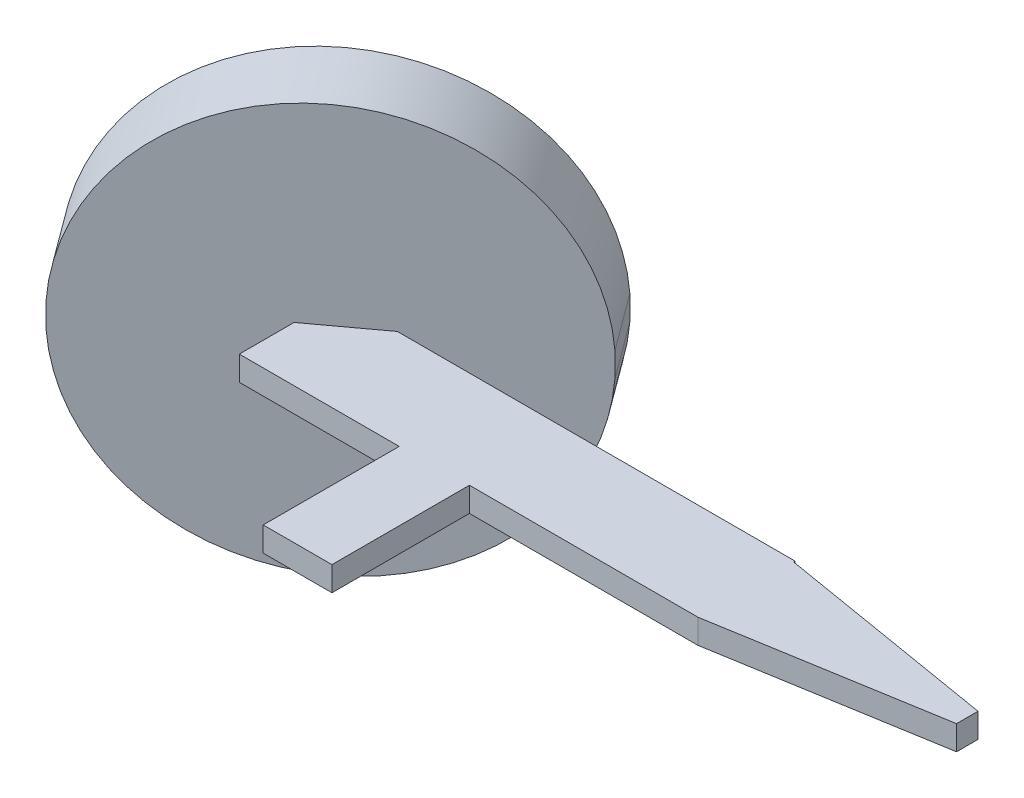
ISO-10303-21;
HEADER;
FILE_DESCRIPTION(('STEP AP214'),'2;1');
FILE_NAME('part.step','',(''),(''),'','','');
FILE_SCHEMA(('AUTOMOTIVE_DESIGN { 1 0 10303 214 1 1 1 1 }'));
ENDSEC;
DATA;
#1=APPLICATION_CONTEXT('core data for automotive mechanical design processes');
#2=APPLICATION_PROTOCOL_DEFINITION('international standard','automotive_design',2000,#1);
#3=PRODUCT_CONTEXT('',#1,'mechanical');
#4=PRODUCT('Part','Part','',(#3));
#5=PRODUCT_RELATED_PRODUCT_CATEGORY('part','',(#4));
#6=PRODUCT_DEFINITION_FORMATION('','',#4);
#7=PRODUCT_DEFINITION_CONTEXT('part definition',#1,'design');
#8=PRODUCT_DEFINITION('design','',#6,#7);
#9=PRODUCT_DEFINITION_SHAPE('','',#8);
#10=(LENGTH_UNIT() NAMED_UNIT(*) SI_UNIT(.MILLI.,.METRE.));
#11=(NAMED_UNIT(*) PLANE_ANGLE_UNIT() SI_UNIT($,.RADIAN.));
#12=(NAMED_UNIT(*) SI_UNIT($,.STERADIAN.) SOLID_ANGLE_UNIT());
#13=UNCERTAINTY_MEASURE_WITH_UNIT(LENGTH_MEASURE(1.E-05),#10,'distance_accuracy_value','');
#14=(GEOMETRIC_REPRESENTATION_CONTEXT(3) GLOBAL_UNCERTAINTY_ASSIGNED_CONTEXT((#13)) GLOBAL_UNIT_ASSIGNED_CONTEXT((#10,
#11,#12)) REPRESENTATION_CONTEXT('',''));
#15=CARTESIAN_POINT('',(0.,0.,0.));
#16=DIRECTION('',(0.,0.,1.));
#17=DIRECTION('',(1.,0.,0.));
#18=AXIS2_PLACEMENT_3D('',#15,#16,#17);
#19=CARTESIAN_POINT('',(0.,-4.,-7.34353741496602));
#20=DIRECTION('',(0.,0.,1.));
#21=DIRECTION('',(1.,0.,0.));
#22=AXIS2_PLACEMENT_3D('',#19,#20,#21);
#23=PLANE('',#22);
#24=DIRECTION('',(1.,0.,0.));
#25=VECTOR('',#24,1.);
#26=CARTESIAN_POINT('',(0.,-4.,-7.34353741496602));
#27=LINE('',#26,#25);
#28=CARTESIAN_POINT('',(5.63004535147378,-4.,-7.34353741496602));
#29=VERTEX_POINT('',#28);
#30=CARTESIAN_POINT('',(43.0820861678005,-4.,-7.34353741496602));
#31=VERTEX_POINT('',#30);
#32=EDGE_CURVE('E148',#29,#31,#27,.T.);
#33=ORIENTED_EDGE('',*,*,#32,.T.);
#34=DIRECTION('',(0.,-1.,0.));
#35=VECTOR('',#34,1.);
#36=CARTESIAN_POINT('',(43.0820861678005,11.,-7.34353741496602));
#37=LINE('',#36,#35);
#38=CARTESIAN_POINT('',(43.0820861678005,0.,-7.34353741496602));
#39=VERTEX_POINT('',#38);
#40=EDGE_CURVE('E241',#39,#31,#37,.T.);
#41=ORIENTED_EDGE('',*,*,#40,.F.);
#42=DIRECTION('',(1.,0.,0.));
#43=VECTOR('',#42,1.);
#44=CARTESIAN_POINT('',(0.,0.,-7.34353741496602));
#45=LINE('',#44,#43);
#46=CARTESIAN_POINT('',(5.63004535147378,0.,-7.34353741496602));
#47=VERTEX_POINT('',#46);
#48=EDGE_CURVE('E175',#47,#39,#45,.T.);
#49=ORIENTED_EDGE('',*,*,#48,.F.);
#50=DIRECTION('',(0.,1.,0.));
#51=VECTOR('',#50,1.);
#52=CARTESIAN_POINT('',(5.63004535147378,-4.,-7.34353741496602));
#53=LINE('',#52,#51);
#54=EDGE_CURVE('E52',#29,#47,#53,.T.);
#55=ORIENTED_EDGE('',*,*,#54,.F.);
#56=EDGE_LOOP('',(#33,#41,#49,#55));
#57=FACE_BOUND('',#56,.T.);
#58=ADVANCED_FACE('F35',(#57),#23,.T.);
#59=CARTESIAN_POINT('',(0.,-4.,0.));
#60=DIRECTION('',(0.,1.,0.));
#61=DIRECTION('',(0.,0.,1.));
#62=AXIS2_PLACEMENT_3D('',#59,#60,#61);
#63=PLANE('',#62);
#64=DIRECTION('',(-0.986254010758301,0.,0.165236274053746));
#65=VECTOR('',#64,1.);
#66=CARTESIAN_POINT('',(-0.0204677894799289,-4.,-0.122167118458326));
#67=LINE('',#66,#65);
#68=CARTESIAN_POINT('',(79.3459916191672,-4.,-13.4191655534149));
#69=VERTEX_POINT('',#68);
#70=EDGE_CURVE('E238',#69,#31,#67,.T.);
#71=ORIENTED_EDGE('',*,*,#70,.T.);
#72=ORIENTED_EDGE('',*,*,#32,.F.);
#73=DIRECTION('',(0.,0.,1.));
#74=VECTOR('',#73,1.);
#75=CARTESIAN_POINT('',(5.63004535147382,-4.,0.));
#76=LINE('',#75,#74);
#77=CARTESIAN_POINT('',(5.63004535147392,-4.,15.1766439909297));
#78=VERTEX_POINT('',#77);
#79=EDGE_CURVE('E138',#29,#78,#76,.T.);
#80=ORIENTED_EDGE('',*,*,#79,.T.);
#81=DIRECTION('',(1.,0.,0.));
#82=VECTOR('',#81,1.);
#83=CARTESIAN_POINT('',(0.,-4.,15.1766439909297));
#84=LINE('',#83,#82);
#85=CARTESIAN_POINT('',(-5.63004535147393,-4.,15.1766439909297));
#86=VERTEX_POINT('',#85);
#87=EDGE_CURVE('E122',#86,#78,#84,.T.);
#88=ORIENTED_EDGE('',*,*,#87,.F.);
#89=DIRECTION('',(0.,0.,1.));
#90=VECTOR('',#89,1.);
#91=CARTESIAN_POINT('',(-5.63004535147393,-4.,0.));
#92=LINE('',#91,#90);
#93=CARTESIAN_POINT('',(-5.63004535147393,-4.,-7.09875283446715));
#94=VERTEX_POINT('',#93);
#95=EDGE_CURVE('E135',#94,#86,#92,.T.);
#96=ORIENTED_EDGE('',*,*,#95,.F.);
#97=DIRECTION('',(1.,0.,0.));
#98=VECTOR('',#97,1.);
#99=CARTESIAN_POINT('',(0.,-4.,-7.09875283446715));
#100=LINE('',#99,#98);
#101=CARTESIAN_POINT('',(-31.8219954648526,-4.,-7.09875283446715));
#102=VERTEX_POINT('',#101);
#103=EDGE_CURVE('E141',#102,#94,#100,.T.);
#104=ORIENTED_EDGE('',*,*,#103,.F.);
#105=DIRECTION('',(0.,0.,-1.));
#106=VECTOR('',#105,1.);
#107=CARTESIAN_POINT('',(-31.8219954648526,-4.,0.));
#108=LINE('',#107,#106);
#109=CARTESIAN_POINT('',(-31.8219954648526,-4.,-16.0784819190834));
#110=VERTEX_POINT('',#109);
#111=EDGE_CURVE('E143',#102,#110,#108,.T.);
#112=ORIENTED_EDGE('',*,*,#111,.T.);
#113=DIRECTION('',(0.805055837353365,0.,-0.593199038049855));
#114=VECTOR('',#113,1.);
#115=CARTESIAN_POINT('',(-18.876099284717,-4.,-25.6175633149728));
#116=LINE('',#115,#114);
#117=CARTESIAN_POINT('',(-22.0830660835763,-4.,-23.2545351473923));
#118=VERTEX_POINT('',#117);
#119=EDGE_CURVE('E155',#110,#118,#116,.T.);
#120=ORIENTED_EDGE('',*,*,#119,.T.);
#121=DIRECTION('',(1.,0.,0.));
#122=VECTOR('',#121,1.);
#123=CARTESIAN_POINT('',(0.,-4.,-23.2545351473923));
#124=LINE('',#123,#122);
#125=CARTESIAN_POINT('',(43.0820861678005,-4.,-23.2545351473923));
#126=VERTEX_POINT('',#125);
#127=EDGE_CURVE('E95',#118,#126,#124,.T.);
#128=ORIENTED_EDGE('',*,*,#127,.T.);
#129=DIRECTION('',(0.,0.,-1.));
#130=VECTOR('',#129,1.);
#131=CARTESIAN_POINT('',(43.0820861678005,-4.,0.));
#132=LINE('',#131,#130);
#133=CARTESIAN_POINT('',(43.0820861678005,-4.,-23.0097505668934));
#134=VERTEX_POINT('',#133);
#135=EDGE_CURVE('E178',#134,#126,#132,.T.);
#136=ORIENTED_EDGE('',*,*,#135,.F.);
#137=DIRECTION('',(-0.986254010758301,0.,-0.165236274053747));
#138=VECTOR('',#137,1.);
#139=CARTESIAN_POINT('',(4.92605390483082,-4.,-29.402384244459));
#140=LINE('',#139,#138);
#141=CARTESIAN_POINT('',(79.3459916191672,-4.,-16.9341224284445));
#142=VERTEX_POINT('',#141);
#143=EDGE_CURVE('E289',#142,#134,#140,.T.);
#144=ORIENTED_EDGE('',*,*,#143,.F.);
#145=DIRECTION('',(0.,0.,1.));
#146=VECTOR('',#145,1.);
#147=CARTESIAN_POINT('',(79.3459916191672,-4.,0.));
#148=LINE('',#147,#146);
#149=EDGE_CURVE('E309',#142,#69,#148,.T.);
#150=ORIENTED_EDGE('',*,*,#149,.T.);
#151=EDGE_LOOP('',(#71,#72,#80,#88,#96,#104,#112,#120,#128,#136,#144,#150));
#152=FACE_BOUND('',#151,.T.);
#153=ADVANCED_FACE('F133',(#152),#63,.F.);
#154=CARTESIAN_POINT('',(0.,0.,0.));
#155=DIRECTION('',(0.,1.,0.));
#156=DIRECTION('',(0.,0.,1.));
#157=AXIS2_PLACEMENT_3D('',#154,#155,#156);
#158=PLANE('',#157);
#159=ORIENTED_EDGE('',*,*,#48,.T.);
#160=DIRECTION('',(0.986254010758301,0.,-0.165236274053746));
#161=VECTOR('',#160,1.);
#162=CARTESIAN_POINT('',(-0.0204677894799289,0.,-0.122167118458326));
#163=LINE('',#162,#161);
#164=CARTESIAN_POINT('',(79.3459916191672,0.,-13.4191655534149));
#165=VERTEX_POINT('',#164);
#166=EDGE_CURVE('E11',#39,#165,#163,.T.);
#167=ORIENTED_EDGE('',*,*,#166,.T.);
#168=DIRECTION('',(0.,0.,-1.));
#169=VECTOR('',#168,1.);
#170=CARTESIAN_POINT('',(79.3459916191672,0.,0.));
#171=LINE('',#170,#169);
#172=CARTESIAN_POINT('',(79.3459916191672,0.,-16.9341224284445));
#173=VERTEX_POINT('',#172);
#174=EDGE_CURVE('E44',#165,#173,#171,.T.);
#175=ORIENTED_EDGE('',*,*,#174,.T.);
#176=DIRECTION('',(0.986254010758301,0.,0.165236274053747));
#177=VECTOR('',#176,1.);
#178=CARTESIAN_POINT('',(4.92605390483082,0.,-29.402384244459));
#179=LINE('',#178,#177);
#180=CARTESIAN_POINT('',(43.0820861678005,0.,-23.0097505668934));
#181=VERTEX_POINT('',#180);
#182=EDGE_CURVE('E208',#181,#173,#179,.T.);
#183=ORIENTED_EDGE('',*,*,#182,.F.);
#184=DIRECTION('',(0.,0.,-1.));
#185=VECTOR('',#184,1.);
#186=CARTESIAN_POINT('',(43.0820861678005,0.,0.));
#187=LINE('',#186,#185);
#188=CARTESIAN_POINT('',(43.0820861678005,0.,-23.2545351473923));
#189=VERTEX_POINT('',#188);
#190=EDGE_CURVE('E151',#181,#189,#187,.T.);
#191=ORIENTED_EDGE('',*,*,#190,.T.);
#192=DIRECTION('',(1.,0.,0.));
#193=VECTOR('',#192,1.);
#194=CARTESIAN_POINT('',(0.,0.,-23.2545351473923));
#195=LINE('',#194,#193);
#196=CARTESIAN_POINT('',(-22.0830660835763,0.,-23.2545351473923));
#197=VERTEX_POINT('',#196);
#198=EDGE_CURVE('E154',#197,#189,#195,.T.);
#199=ORIENTED_EDGE('',*,*,#198,.F.);
#200=DIRECTION('',(0.805055837353365,0.,-0.593199038049855));
#201=VECTOR('',#200,1.);
#202=CARTESIAN_POINT('',(-18.876099284717,0.,-25.6175633149728));
#203=LINE('',#202,#201);
#204=CARTESIAN_POINT('',(-31.8219954648526,0.,-16.0784819190833));
#205=VERTEX_POINT('',#204);
#206=EDGE_CURVE('E180',#205,#197,#203,.T.);
#207=ORIENTED_EDGE('',*,*,#206,.F.);
#208=DIRECTION('',(0.,0.,-1.));
#209=VECTOR('',#208,1.);
#210=CARTESIAN_POINT('',(-31.8219954648526,0.,0.));
#211=LINE('',#210,#209);
#212=CARTESIAN_POINT('',(-31.8219954648526,0.,-7.09875283446715));
#213=VERTEX_POINT('',#212);
#214=EDGE_CURVE('E164',#213,#205,#211,.T.);
#215=ORIENTED_EDGE('',*,*,#214,.F.);
#216=DIRECTION('',(1.,0.,0.));
#217=VECTOR('',#216,1.);
#218=CARTESIAN_POINT('',(0.,0.,-7.09875283446715));
#219=LINE('',#218,#217);
#220=CARTESIAN_POINT('',(-5.63004535147393,0.,-7.09875283446715));
#221=VERTEX_POINT('',#220);
#222=EDGE_CURVE('E167',#213,#221,#219,.T.);
#223=ORIENTED_EDGE('',*,*,#222,.T.);
#224=DIRECTION('',(0.,0.,1.));
#225=VECTOR('',#224,1.);
#226=CARTESIAN_POINT('',(-5.63004535147393,0.,0.));
#227=LINE('',#226,#225);
#228=CARTESIAN_POINT('',(-5.63004535147393,0.,15.1766439909297));
#229=VERTEX_POINT('',#228);
#230=EDGE_CURVE('E170',#221,#229,#227,.T.);
#231=ORIENTED_EDGE('',*,*,#230,.T.);
#232=DIRECTION('',(1.,0.,0.));
#233=VECTOR('',#232,1.);
#234=CARTESIAN_POINT('',(0.,0.,15.1766439909297));
#235=LINE('',#234,#233);
#236=CARTESIAN_POINT('',(5.63004535147392,0.,15.1766439909297));
#237=VERTEX_POINT('',#236);
#238=EDGE_CURVE('E124',#229,#237,#235,.T.);
#239=ORIENTED_EDGE('',*,*,#238,.T.);
#240=DIRECTION('',(0.,0.,1.));
#241=VECTOR('',#240,1.);
#242=CARTESIAN_POINT('',(5.63004535147382,0.,0.));
#243=LINE('',#242,#241);
#244=EDGE_CURVE('E173',#47,#237,#243,.T.);
#245=ORIENTED_EDGE('',*,*,#244,.F.);
#246=EDGE_LOOP('',(#159,#167,#175,#183,#191,#199,#207,#215,#223,#231,#239,#245));
#247=FACE_BOUND('',#246,.T.);
#248=ADVANCED_FACE('F215',(#247),#158,.T.);
#249=CARTESIAN_POINT('',(5.63004535147382,-4.,0.));
#250=DIRECTION('',(-1.,0.,0.));
#251=DIRECTION('',(0.,0.,1.));
#252=AXIS2_PLACEMENT_3D('',#249,#250,#251);
#253=PLANE('',#252);
#254=ORIENTED_EDGE('',*,*,#244,.T.);
#255=DIRECTION('',(0.,1.,0.));
#256=VECTOR('',#255,1.);
#257=CARTESIAN_POINT('',(5.63004535147392,-4.,15.1766439909297));
#258=LINE('',#257,#256);
#259=EDGE_CURVE('E83',#78,#237,#258,.T.);
#260=ORIENTED_EDGE('',*,*,#259,.F.);
#261=ORIENTED_EDGE('',*,*,#79,.F.);
#262=ORIENTED_EDGE('',*,*,#54,.T.);
#263=EDGE_LOOP('',(#254,#260,#261,#262));
#264=FACE_BOUND('',#263,.T.);
#265=ADVANCED_FACE('F319',(#264),#253,.F.);
#266=CARTESIAN_POINT('',(0.,-4.,15.1766439909297));
#267=DIRECTION('',(0.,0.,1.));
#268=DIRECTION('',(1.,0.,0.));
#269=AXIS2_PLACEMENT_3D('',#266,#267,#268);
#270=PLANE('',#269);
#271=ORIENTED_EDGE('',*,*,#238,.F.);
#272=DIRECTION('',(0.,1.,0.));
#273=VECTOR('',#272,1.);
#274=CARTESIAN_POINT('',(-5.63004535147393,-4.,15.1766439909297));
#275=LINE('',#274,#273);
#276=EDGE_CURVE('E119',#86,#229,#275,.T.);
#277=ORIENTED_EDGE('',*,*,#276,.F.);
#278=ORIENTED_EDGE('',*,*,#87,.T.);
#279=ORIENTED_EDGE('',*,*,#259,.T.);
#280=EDGE_LOOP('',(#271,#277,#278,#279));
#281=FACE_BOUND('',#280,.T.);
#282=ADVANCED_FACE('F121',(#281),#270,.T.);
#283=CARTESIAN_POINT('',(-5.63004535147393,-4.,0.));
#284=DIRECTION('',(-1.,0.,0.));
#285=DIRECTION('',(0.,0.,1.));
#286=AXIS2_PLACEMENT_3D('',#283,#284,#285);
#287=PLANE('',#286);
#288=ORIENTED_EDGE('',*,*,#230,.F.);
#289=DIRECTION('',(0.,1.,0.));
#290=VECTOR('',#289,1.);
#291=CARTESIAN_POINT('',(-5.63004535147393,-4.,-7.09875283446715));
#292=LINE('',#291,#290);
#293=EDGE_CURVE('E129',#94,#221,#292,.T.);
#294=ORIENTED_EDGE('',*,*,#293,.F.);
#295=ORIENTED_EDGE('',*,*,#95,.T.);
#296=ORIENTED_EDGE('',*,*,#276,.T.);
#297=EDGE_LOOP('',(#288,#294,#295,#296));
#298=FACE_BOUND('',#297,.T.);
#299=ADVANCED_FACE('F140',(#298),#287,.T.);
#300=CARTESIAN_POINT('',(0.,-4.,-7.09875283446715));
#301=DIRECTION('',(0.,0.,1.));
#302=DIRECTION('',(1.,0.,0.));
#303=AXIS2_PLACEMENT_3D('',#300,#301,#302);
#304=PLANE('',#303);
#305=ORIENTED_EDGE('',*,*,#222,.F.);
#306=DIRECTION('',(0.,1.,0.));
#307=VECTOR('',#306,1.);
#308=CARTESIAN_POINT('',(-31.8219954648526,-4.,-7.09875283446715));
#309=LINE('',#308,#307);
#310=EDGE_CURVE('E183',#102,#213,#309,.T.);
#311=ORIENTED_EDGE('',*,*,#310,.F.);
#312=ORIENTED_EDGE('',*,*,#103,.T.);
#313=ORIENTED_EDGE('',*,*,#293,.T.);
#314=EDGE_LOOP('',(#305,#311,#312,#313));
#315=FACE_BOUND('',#314,.T.);
#316=ADVANCED_FACE('F308',(#315),#304,.T.);
#317=CARTESIAN_POINT('',(-31.8219954648526,-4.,0.));
#318=DIRECTION('',(1.,0.,0.));
#319=DIRECTION('',(0.,0.,-1.));
#320=AXIS2_PLACEMENT_3D('',#317,#318,#319);
#321=PLANE('',#320);
#322=ORIENTED_EDGE('',*,*,#214,.T.);
#323=DIRECTION('',(0.,1.,0.));
#324=VECTOR('',#323,1.);
#325=CARTESIAN_POINT('',(-31.8219954648526,-4.,-16.0784819190834));
#326=LINE('',#325,#324);
#327=EDGE_CURVE('E185',#110,#205,#326,.T.);
#328=ORIENTED_EDGE('',*,*,#327,.F.);
#329=ORIENTED_EDGE('',*,*,#111,.F.);
#330=ORIENTED_EDGE('',*,*,#310,.T.);
#331=EDGE_LOOP('',(#322,#328,#329,#330));
#332=FACE_BOUND('',#331,.T.);
#333=ADVANCED_FACE('F273',(#332),#321,.F.);
#334=CARTESIAN_POINT('',(-18.876099284717,-4.,-25.6175633149728));
#335=DIRECTION('',(0.593199038049855,0.,0.805055837353365));
#336=DIRECTION('',(0.805055837353365,0.,-0.593199038049855));
#337=AXIS2_PLACEMENT_3D('',#334,#335,#336);
#338=PLANE('',#337);
#339=ORIENTED_EDGE('',*,*,#119,.F.);
#340=ORIENTED_EDGE('',*,*,#327,.T.);
#341=ORIENTED_EDGE('',*,*,#206,.T.);
#342=DIRECTION('',(0.,1.,0.));
#343=VECTOR('',#342,1.);
#344=CARTESIAN_POINT('',(-22.0830660835763,-4.,-23.2545351473923));
#345=LINE('',#344,#343);
#346=EDGE_CURVE('E200',#118,#197,#345,.T.);
#347=ORIENTED_EDGE('',*,*,#346,.F.);
#348=EDGE_LOOP('',(#339,#340,#341,#347));
#349=FACE_BOUND('',#348,.T.);
#350=DIRECTION('',(0.,1.,0.));
#351=VECTOR('',#350,1.);
#352=CARTESIAN_POINT('',(-55.2233134666192,-4.,1.16459450327121));
#353=LINE('',#352,#351);
#354=CARTESIAN_POINT('',(-55.2233134666192,-4.,1.16459450327121));
#355=VERTEX_POINT('',#354);
#356=CARTESIAN_POINT('',(-55.2233134666192,0.,1.16459450327121));
#357=VERTEX_POINT('',#356);
#358=EDGE_CURVE('E188',#355,#357,#353,.T.);
#359=ORIENTED_EDGE('',*,*,#358,.F.);
#360=CARTESIAN_POINT('',(-28.3950113378684,-2.,-18.6036281179138));
#361=DIRECTION('',(0.593199038049855,0.,0.805055837353365));
#362=DIRECTION('',(0.805055837353365,0.,-0.593199038049855));
#363=AXIS2_PLACEMENT_3D('',#360,#361,#362);
#364=CIRCLE('',#363,33.3847333479282);
#365=CARTESIAN_POINT('',(-1.56670920911763,-4.,-38.3718507390988));
#366=VERTEX_POINT('',#365);
#367=EDGE_CURVE('E252',#366,#355,#364,.F.);
#368=ORIENTED_EDGE('',*,*,#367,.F.);
#369=DIRECTION('',(0.,1.,0.));
#370=VECTOR('',#369,1.);
#371=CARTESIAN_POINT('',(-1.56670920911763,-4.,-38.3718507390988));
#372=LINE('',#371,#370);
#373=CARTESIAN_POINT('',(-1.56670920911763,0.,-38.3718507390989));
#374=VERTEX_POINT('',#373);
#375=EDGE_CURVE('E197',#366,#374,#372,.T.);
#376=ORIENTED_EDGE('',*,*,#375,.T.);
#377=CARTESIAN_POINT('',(-28.3950113378684,-2.,-18.6036281179138));
#378=DIRECTION('',(0.593199038049855,0.,0.805055837353365));
#379=DIRECTION('',(0.805055837353365,0.,-0.593199038049855));
#380=AXIS2_PLACEMENT_3D('',#377,#378,#379);
#381=CIRCLE('',#380,33.3847333479282);
#382=EDGE_CURVE('E254',#357,#374,#381,.F.);
#383=ORIENTED_EDGE('',*,*,#382,.F.);
#384=EDGE_LOOP('',(#359,#368,#376,#383));
#385=FACE_BOUND('',#384,.T.);
#386=ADVANCED_FACE('F276',(#349,#385),#338,.T.);
#387=CARTESIAN_POINT('',(-36.3472141819022,-4.,26.782157818244));
#388=DIRECTION('',(0.805055837353365,0.,-0.593199038049855));
#389=DIRECTION('',(-0.593199038049855,0.,-0.805055837353365));
#390=AXIS2_PLACEMENT_3D('',#387,#388,#389);
#391=PLANE('',#390);
#392=DIRECTION('',(-0.593199038049855,0.,-0.805055837353365));
#393=VECTOR('',#392,1.);
#394=CARTESIAN_POINT('',(-36.3472141819022,0.,26.782157818244));
#395=LINE('',#394,#393);
#396=CARTESIAN_POINT('',(-62.0772817205875,0.,-8.13721955568571));
#397=VERTEX_POINT('',#396);
#398=EDGE_CURVE('E161',#357,#397,#395,.T.);
#399=ORIENTED_EDGE('',*,*,#398,.T.);
#400=DIRECTION('',(0.,1.,0.));
#401=VECTOR('',#400,1.);
#402=CARTESIAN_POINT('',(-62.0772817205875,-4.,-8.13721955568571));
#403=LINE('',#402,#401);
#404=CARTESIAN_POINT('',(-62.0772817205876,-4.,-8.13721955568572));
#405=VERTEX_POINT('',#404);
#406=EDGE_CURVE('E191',#405,#397,#403,.T.);
#407=ORIENTED_EDGE('',*,*,#406,.F.);
#408=DIRECTION('',(-0.593199038049855,0.,-0.805055837353365));
#409=VECTOR('',#408,1.);
#410=CARTESIAN_POINT('',(-36.3472141819022,-4.,26.782157818244));
#411=LINE('',#410,#409);
#412=EDGE_CURVE('E266',#355,#405,#411,.T.);
#413=ORIENTED_EDGE('',*,*,#412,.F.);
#414=ORIENTED_EDGE('',*,*,#358,.T.);
#415=EDGE_LOOP('',(#399,#407,#413,#414));
#416=FACE_BOUND('',#415,.T.);
#417=ADVANCED_FACE('F332',(#416),#391,.F.);
#418=CARTESIAN_POINT('',(-25.7300675386854,-4.,-34.9193773739297));
#419=DIRECTION('',(0.593199038049855,0.,0.805055837353365));
#420=DIRECTION('',(0.805055837353365,0.,-0.593199038049855));
#421=AXIS2_PLACEMENT_3D('',#418,#419,#420);
#422=PLANE('',#421);
#423=ORIENTED_EDGE('',*,*,#406,.T.);
#424=CARTESIAN_POINT('',(-35.2489795918368,-2.,-27.9054421768708));
#425=DIRECTION('',(-0.593199038049855,0.,-0.805055837353365));
#426=DIRECTION('',(-0.805055837353365,0.,0.593199038049855));
#427=AXIS2_PLACEMENT_3D('',#424,#425,#426);
#428=CIRCLE('',#427,33.3847333479282);
#429=CARTESIAN_POINT('',(-8.42067746308598,0.,-47.6736647980558));
#430=VERTEX_POINT('',#429);
#431=EDGE_CURVE('E240',#397,#430,#428,.T.);
#432=ORIENTED_EDGE('',*,*,#431,.T.);
#433=DIRECTION('',(0.,1.,0.));
#434=VECTOR('',#433,1.);
#435=CARTESIAN_POINT('',(-8.42067746308597,-4.,-47.6736647980558));
#436=LINE('',#435,#434);
#437=CARTESIAN_POINT('',(-8.42067746308597,-4.,-47.6736647980558));
#438=VERTEX_POINT('',#437);
#439=EDGE_CURVE('E194',#438,#430,#436,.T.);
#440=ORIENTED_EDGE('',*,*,#439,.F.);
#441=CARTESIAN_POINT('',(-35.2489795918368,-2.,-27.9054421768708));
#442=DIRECTION('',(-0.593199038049855,0.,-0.805055837353365));
#443=DIRECTION('',(-0.805055837353365,0.,0.593199038049855));
#444=AXIS2_PLACEMENT_3D('',#441,#442,#443);
#445=CIRCLE('',#444,33.3847333479282);
#446=EDGE_CURVE('E244',#438,#405,#445,.T.);
#447=ORIENTED_EDGE('',*,*,#446,.T.);
#448=EDGE_LOOP('',(#423,#432,#440,#447));
#449=FACE_BOUND('',#448,.T.);
#450=ADVANCED_FACE('F335',(#449),#422,.F.);
#451=CARTESIAN_POINT('',(17.3093900755994,-4.,-12.754287424126));
#452=DIRECTION('',(0.805055837353365,0.,-0.593199038049855));
#453=DIRECTION('',(-0.593199038049855,0.,-0.805055837353365));
#454=AXIS2_PLACEMENT_3D('',#451,#452,#453);
#455=PLANE('',#454);
#456=DIRECTION('',(-0.593199038049855,0.,-0.805055837353365));
#457=VECTOR('',#456,1.);
#458=CARTESIAN_POINT('',(17.3093900755994,0.,-12.754287424126));
#459=LINE('',#458,#457);
#460=EDGE_CURVE('E158',#374,#430,#459,.T.);
#461=ORIENTED_EDGE('',*,*,#460,.F.);
#462=ORIENTED_EDGE('',*,*,#375,.F.);
#463=DIRECTION('',(-0.593199038049855,0.,-0.805055837353365));
#464=VECTOR('',#463,1.);
#465=CARTESIAN_POINT('',(17.3093900755994,-4.,-12.754287424126));
#466=LINE('',#465,#464);
#467=EDGE_CURVE('E263',#366,#438,#466,.T.);
#468=ORIENTED_EDGE('',*,*,#467,.T.);
#469=ORIENTED_EDGE('',*,*,#439,.T.);
#470=EDGE_LOOP('',(#461,#462,#468,#469));
#471=FACE_BOUND('',#470,.T.);
#472=ADVANCED_FACE('F339',(#471),#455,.T.);
#473=CARTESIAN_POINT('',(0.,-4.,-23.2545351473923));
#474=DIRECTION('',(0.,0.,1.));
#475=DIRECTION('',(1.,0.,0.));
#476=AXIS2_PLACEMENT_3D('',#473,#474,#475);
#477=PLANE('',#476);
#478=ORIENTED_EDGE('',*,*,#198,.T.);
#479=DIRECTION('',(0.,1.,0.));
#480=VECTOR('',#479,1.);
#481=CARTESIAN_POINT('',(43.0820861678005,-4.,-23.2545351473923));
#482=LINE('',#481,#480);
#483=EDGE_CURVE('E203',#126,#189,#482,.T.);
#484=ORIENTED_EDGE('',*,*,#483,.F.);
#485=ORIENTED_EDGE('',*,*,#127,.F.);
#486=ORIENTED_EDGE('',*,*,#346,.T.);
#487=EDGE_LOOP('',(#478,#484,#485,#486));
#488=FACE_BOUND('',#487,.T.);
#489=ADVANCED_FACE('F282',(#488),#477,.F.);
#490=CARTESIAN_POINT('',(43.0820861678005,-4.,0.));
#491=DIRECTION('',(1.,0.,0.));
#492=DIRECTION('',(0.,0.,-1.));
#493=AXIS2_PLACEMENT_3D('',#490,#491,#492);
#494=PLANE('',#493);
#495=ORIENTED_EDGE('',*,*,#190,.F.);
#496=DIRECTION('',(0.,1.,0.));
#497=VECTOR('',#496,1.);
#498=CARTESIAN_POINT('',(43.0820861678005,-4.,-23.0097505668934));
#499=LINE('',#498,#497);
#500=EDGE_CURVE('E150',#134,#181,#499,.T.);
#501=ORIENTED_EDGE('',*,*,#500,.F.);
#502=ORIENTED_EDGE('',*,*,#135,.T.);
#503=ORIENTED_EDGE('',*,*,#483,.T.);
#504=EDGE_LOOP('',(#495,#501,#502,#503));
#505=FACE_BOUND('',#504,.T.);
#506=ADVANCED_FACE('F37',(#505),#494,.T.);
#507=CARTESIAN_POINT('',(27.5682906232002,-2.,57.3465674006784));
#508=DIRECTION('',(-0.593199038049855,0.,-0.805055837353365));
#509=DIRECTION('',(-0.805055837353365,0.,0.593199038049855));
#510=AXIS2_PLACEMENT_3D('',#507,#508,#509);
#511=CYLINDRICAL_SURFACE('',#510,33.3847333479282);
#512=ORIENTED_EDGE('',*,*,#398,.F.);
#513=ORIENTED_EDGE('',*,*,#382,.T.);
#514=ORIENTED_EDGE('',*,*,#460,.T.);
#515=ORIENTED_EDGE('',*,*,#431,.F.);
#516=EDGE_LOOP('',(#512,#513,#514,#515));
#517=FACE_BOUND('',#516,.T.);
#518=ADVANCED_FACE('F347',(#517),#511,.T.);
#519=CARTESIAN_POINT('',(27.5682906232002,-2.,57.3465674006784));
#520=DIRECTION('',(-0.593199038049855,0.,-0.805055837353365));
#521=DIRECTION('',(-0.805055837353365,0.,0.593199038049855));
#522=AXIS2_PLACEMENT_3D('',#519,#520,#521);
#523=CYLINDRICAL_SURFACE('',#522,33.3847333479282);
#524=ORIENTED_EDGE('',*,*,#467,.F.);
#525=ORIENTED_EDGE('',*,*,#367,.T.);
#526=ORIENTED_EDGE('',*,*,#412,.T.);
#527=ORIENTED_EDGE('',*,*,#446,.F.);
#528=EDGE_LOOP('',(#524,#525,#526,#527));
#529=FACE_BOUND('',#528,.T.);
#530=ADVANCED_FACE('F351',(#529),#523,.T.);
#531=CARTESIAN_POINT('',(79.3459916191672,11.,0.));
#532=DIRECTION('',(1.,0.,0.));
#533=DIRECTION('',(0.,0.,-1.));
#534=AXIS2_PLACEMENT_3D('',#531,#532,#533);
#535=PLANE('',#534);
#536=DIRECTION('',(0.,-1.,0.));
#537=VECTOR('',#536,1.);
#538=CARTESIAN_POINT('',(79.3459916191672,11.,-13.4191655534149));
#539=LINE('',#538,#537);
#540=EDGE_CURVE('E228',#165,#69,#539,.T.);
#541=ORIENTED_EDGE('',*,*,#540,.T.);
#542=ORIENTED_EDGE('',*,*,#149,.F.);
#543=DIRECTION('',(0.,-1.,0.));
#544=VECTOR('',#543,1.);
#545=CARTESIAN_POINT('',(79.3459916191672,11.,-16.9341224284445));
#546=LINE('',#545,#544);
#547=EDGE_CURVE('E231',#173,#142,#546,.T.);
#548=ORIENTED_EDGE('',*,*,#547,.F.);
#549=ORIENTED_EDGE('',*,*,#174,.F.);
#550=EDGE_LOOP('',(#541,#542,#548,#549));
#551=FACE_BOUND('',#550,.T.);
#552=ADVANCED_FACE('F226',(#551),#535,.T.);
#553=CARTESIAN_POINT('',(-0.0204677894799289,11.,-0.122167118458326));
#554=DIRECTION('',(0.165236274053746,0.,0.986254010758301));
#555=DIRECTION('',(0.986254010758301,0.,-0.165236274053746));
#556=AXIS2_PLACEMENT_3D('',#553,#554,#555);
#557=PLANE('',#556);
#558=ORIENTED_EDGE('',*,*,#40,.T.);
#559=ORIENTED_EDGE('',*,*,#70,.F.);
#560=ORIENTED_EDGE('',*,*,#540,.F.);
#561=ORIENTED_EDGE('',*,*,#166,.F.);
#562=EDGE_LOOP('',(#558,#559,#560,#561));
#563=FACE_BOUND('',#562,.T.);
#564=ADVANCED_FACE('F236',(#563),#557,.T.);
#565=CARTESIAN_POINT('',(4.92605390483082,11.,-29.402384244459));
#566=DIRECTION('',(-0.165236274053747,0.,0.986254010758301));
#567=DIRECTION('',(0.986254010758301,0.,0.165236274053747));
#568=AXIS2_PLACEMENT_3D('',#565,#566,#567);
#569=PLANE('',#568);
#570=ORIENTED_EDGE('',*,*,#182,.T.);
#571=ORIENTED_EDGE('',*,*,#547,.T.);
#572=ORIENTED_EDGE('',*,*,#143,.T.);
#573=ORIENTED_EDGE('',*,*,#500,.T.);
#574=EDGE_LOOP('',(#570,#571,#572,#573));
#575=FACE_BOUND('',#574,.T.);
#576=ADVANCED_FACE('F363',(#575),#569,.F.);
#577=CLOSED_SHELL('',(#58,#153,#248,#265,#282,#299,#316,#333,#386,#417,#450,#472,#489,#506,#518,
#530,#552,#564,#576));
#578=MANIFOLD_SOLID_BREP('B2',#577);
#579=ADVANCED_BREP_SHAPE_REPRESENTATION('',(#18,#578),#14);
#580=SHAPE_DEFINITION_REPRESENTATION(#9,#579);
ENDSEC;
END-ISO-10303-21;
